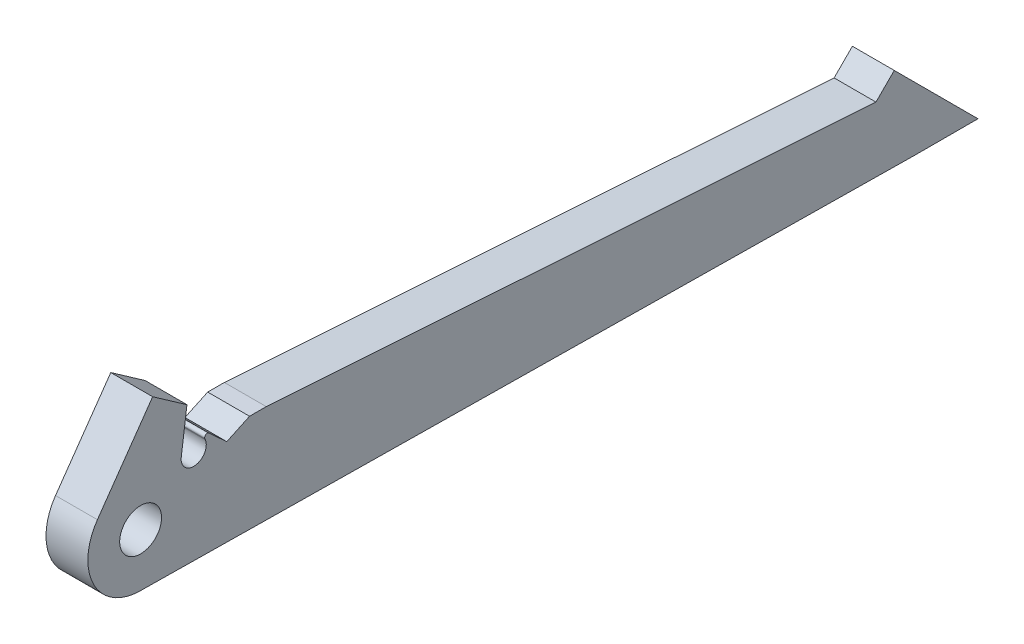
ISO-10303-21;
HEADER;
FILE_DESCRIPTION(('STEP AP214'),'2;1');
FILE_NAME('part.step','',(''),(''),'','','');
FILE_SCHEMA(('AUTOMOTIVE_DESIGN { 1 0 10303 214 1 1 1 1 }'));
ENDSEC;
DATA;
#1=APPLICATION_CONTEXT('core data for automotive mechanical design processes');
#2=APPLICATION_PROTOCOL_DEFINITION('international standard','automotive_design',2000,#1);
#3=PRODUCT_CONTEXT('',#1,'mechanical');
#4=PRODUCT('Part','Part','',(#3));
#5=PRODUCT_RELATED_PRODUCT_CATEGORY('part','',(#4));
#6=PRODUCT_DEFINITION_FORMATION('','',#4);
#7=PRODUCT_DEFINITION_CONTEXT('part definition',#1,'design');
#8=PRODUCT_DEFINITION('design','',#6,#7);
#9=PRODUCT_DEFINITION_SHAPE('','',#8);
#10=(LENGTH_UNIT() NAMED_UNIT(*) SI_UNIT(.MILLI.,.METRE.));
#11=(NAMED_UNIT(*) PLANE_ANGLE_UNIT() SI_UNIT($,.RADIAN.));
#12=(NAMED_UNIT(*) SI_UNIT($,.STERADIAN.) SOLID_ANGLE_UNIT());
#13=UNCERTAINTY_MEASURE_WITH_UNIT(LENGTH_MEASURE(1.E-05),#10,'distance_accuracy_value','');
#14=(GEOMETRIC_REPRESENTATION_CONTEXT(3) GLOBAL_UNCERTAINTY_ASSIGNED_CONTEXT((#13)) GLOBAL_UNIT_ASSIGNED_CONTEXT((#10,
#11,#12)) REPRESENTATION_CONTEXT('',''));
#15=CARTESIAN_POINT('',(0.,0.,0.));
#16=DIRECTION('',(0.,0.,1.));
#17=DIRECTION('',(1.,0.,0.));
#18=AXIS2_PLACEMENT_3D('',#15,#16,#17);
#19=CARTESIAN_POINT('',(6.35,9.525,-176.47164647412));
#20=DIRECTION('',(1.,0.,0.));
#21=DIRECTION('',(0.,0.,-1.));
#22=AXIS2_PLACEMENT_3D('',#19,#20,#21);
#23=PLANE('',#22);
#24=DIRECTION('',(0.,0.675997213115544,0.736904178207735));
#25=VECTOR('',#24,1.);
#26=CARTESIAN_POINT('',(6.35,14.554850228429,-189.540378321137));
#27=LINE('',#26,#25);
#28=CARTESIAN_POINT('',(6.35,14.554850228429,-189.540378321137));
#29=VERTEX_POINT('',#28);
#30=CARTESIAN_POINT('',(6.35,17.0473052344062,-186.823354534258));
#31=VERTEX_POINT('',#30);
#32=EDGE_CURVE('E245',#29,#31,#27,.T.);
#33=ORIENTED_EDGE('',*,*,#32,.T.);
#34=CARTESIAN_POINT('',(6.35,16.766544742509,-186.565799596061));
#35=DIRECTION('',(1.,0.,0.));
#36=DIRECTION('',(0.,0.,-1.));
#37=AXIS2_PLACEMENT_3D('',#34,#35,#36);
#38=CIRCLE('',#37,0.381);
#39=CARTESIAN_POINT('',(6.35,16.6212011416771,-186.213611808514));
#40=VERTEX_POINT('',#39);
#41=EDGE_CURVE('E51',#31,#40,#38,.T.);
#42=ORIENTED_EDGE('',*,*,#41,.T.);
#43=DIRECTION('',(0.,-0.924377395136311,-0.381479267275442));
#44=VECTOR('',#43,1.);
#45=CARTESIAN_POINT('',(6.35,18.2069999283971,-185.559172006775));
#46=LINE('',#45,#44);
#47=CARTESIAN_POINT('',(6.35,16.4460609906625,-186.285890010935));
#48=VERTEX_POINT('',#47);
#49=EDGE_CURVE('E247',#40,#48,#46,.T.);
#50=ORIENTED_EDGE('',*,*,#49,.T.);
#51=CARTESIAN_POINT('',(6.35,15.7193429865027,-184.524951073201));
#52=DIRECTION('',(-1.,0.,0.));
#53=DIRECTION('',(0.,0.,1.));
#54=AXIS2_PLACEMENT_3D('',#51,#52,#53);
#55=CIRCLE('',#54,1.90499999999998);
#56=CARTESIAN_POINT('',(6.35,15.9704562023801,-182.636574216529));
#57=VERTEX_POINT('',#56);
#58=EDGE_CURVE('E249',#48,#57,#55,.T.);
#59=ORIENTED_EDGE('',*,*,#58,.T.);
#60=DIRECTION('',(0.,0.991273940509858,-0.131817961090505));
#61=VECTOR('',#60,1.);
#62=CARTESIAN_POINT('',(6.35,15.9704562023801,-182.636574216529));
#63=LINE('',#62,#61);
#64=CARTESIAN_POINT('',(6.35,22.4356903032563,-183.496310301906));
#65=VERTEX_POINT('',#64);
#66=EDGE_CURVE('E251',#57,#65,#63,.T.);
#67=ORIENTED_EDGE('',*,*,#66,.T.);
#68=DIRECTION('',(0.,0.573576436351047,0.819152044288991));
#69=VECTOR('',#68,1.);
#70=CARTESIAN_POINT('',(6.35,26.0779006740854,-178.294694820671));
#71=LINE('',#70,#69);
#72=CARTESIAN_POINT('',(6.35,26.0779006740854,-178.294694820671));
#73=VERTEX_POINT('',#72);
#74=EDGE_CURVE('E253',#65,#73,#71,.T.);
#75=ORIENTED_EDGE('',*,*,#74,.T.);
#76=DIRECTION('',(0.,-0.819152044288991,0.573576436351048));
#77=VECTOR('',#76,1.);
#78=CARTESIAN_POINT('',(6.35,14.1141850672447,-169.917610967764));
#79=LINE('',#78,#77);
#80=CARTESIAN_POINT('',(6.35,14.1141850672447,-169.917610967764));
#81=VERTEX_POINT('',#80);
#82=EDGE_CURVE('E255',#73,#81,#79,.T.);
#83=ORIENTED_EDGE('',*,*,#82,.T.);
#84=CARTESIAN_POINT('',(6.35,9.525,-176.47164647412));
#85=DIRECTION('',(1.,0.,0.));
#86=DIRECTION('',(0.,0.,-1.));
#87=AXIS2_PLACEMENT_3D('',#84,#85,#86);
#88=CIRCLE('',#87,8.00100000000001);
#89=CARTESIAN_POINT('',(6.35,1.52470715135464,-176.365272906379));
#90=VERTEX_POINT('',#89);
#91=EDGE_CURVE('E236',#81,#90,#88,.T.);
#92=ORIENTED_EDGE('',*,*,#91,.T.);
#93=DIRECTION('',(0.,-0.0132950340883751,-0.999911617128528));
#94=VECTOR('',#93,1.);
#95=CARTESIAN_POINT('',(6.35,1.27000000001228,-195.521646474134));
#96=LINE('',#95,#94);
#97=CARTESIAN_POINT('',(6.35,1.27000000001228,-195.521646474134));
#98=VERTEX_POINT('',#97);
#99=EDGE_CURVE('E239',#90,#98,#96,.T.);
#100=ORIENTED_EDGE('',*,*,#99,.T.);
#101=DIRECTION('',(0.,-0.0129021517906544,-0.999916763775451));
#102=VECTOR('',#101,1.);
#103=CARTESIAN_POINT('',(6.35,1.27000000001228,-195.521646474134));
#104=LINE('',#103,#102);
#105=CARTESIAN_POINT('',(6.35,1.22755538373154E-11,-293.946646474108));
#106=VERTEX_POINT('',#105);
#107=EDGE_CURVE('E225',#98,#106,#104,.T.);
#108=ORIENTED_EDGE('',*,*,#107,.T.);
#109=DIRECTION('',(0.,0.,-1.));
#110=VECTOR('',#109,1.);
#111=CARTESIAN_POINT('',(6.35,1.22755538373154E-11,-293.946646474108));
#112=LINE('',#111,#110);
#113=CARTESIAN_POINT('',(6.35,1.22755538373154E-11,-303.471646474121));
#114=VERTEX_POINT('',#113);
#115=EDGE_CURVE('E166',#106,#114,#112,.T.);
#116=ORIENTED_EDGE('',*,*,#115,.T.);
#117=DIRECTION('',(0.,0.70710678118655,0.707106781186545));
#118=VECTOR('',#117,1.);
#119=CARTESIAN_POINT('',(6.35,9.52500000002455,-293.946646474108));
#120=LINE('',#119,#118);
#121=CARTESIAN_POINT('',(6.35,12.7000000000246,-290.771646474108));
#122=VERTEX_POINT('',#121);
#123=EDGE_CURVE('E158',#114,#122,#120,.T.);
#124=ORIENTED_EDGE('',*,*,#123,.T.);
#125=DIRECTION('',(0.,-0.707106781186553,0.707106781186541));
#126=VECTOR('',#125,1.);
#127=CARTESIAN_POINT('',(6.35,12.7000000000246,-290.771646474108));
#128=LINE('',#127,#126);
#129=CARTESIAN_POINT('',(6.35,9.92631493372846,-287.997961407812));
#130=VERTEX_POINT('',#129);
#131=EDGE_CURVE('E162',#122,#130,#128,.T.);
#132=ORIENTED_EDGE('',*,*,#131,.T.);
#133=DIRECTION('',(0.,0.0673097998383365,0.997732123791613));
#134=VECTOR('',#133,1.);
#135=CARTESIAN_POINT('',(6.35,16.1650258056597,-195.52164647412));
#136=LINE('',#135,#134);
#137=CARTESIAN_POINT('',(6.35,16.1650258056597,-195.52164647412));
#138=VERTEX_POINT('',#137);
#139=EDGE_CURVE('E169',#130,#138,#136,.T.);
#140=ORIENTED_EDGE('',*,*,#139,.T.);
#141=DIRECTION('',(0.,5.50284273886857E-13,1.));
#142=VECTOR('',#141,1.);
#143=CARTESIAN_POINT('',(6.35,16.1650258056611,-192.993410989747));
#144=LINE('',#143,#142);
#145=CARTESIAN_POINT('',(6.35,16.1650258056611,-192.993410989747));
#146=VERTEX_POINT('',#145);
#147=EDGE_CURVE('E241',#138,#146,#144,.T.);
#148=ORIENTED_EDGE('',*,*,#147,.T.);
#149=DIRECTION('',(0.,-0.422618261740698,0.90630778703665));
#150=VECTOR('',#149,1.);
#151=CARTESIAN_POINT('',(6.35,14.8232128246343,-190.115883765906));
#152=LINE('',#151,#150);
#153=EDGE_CURVE('E243',#146,#29,#152,.T.);
#154=ORIENTED_EDGE('',*,*,#153,.T.);
#155=EDGE_LOOP('',(#33,#42,#50,#59,#67,#75,#83,#92,#100,#108,#116,#124,#132,#140,#148,#154));
#156=FACE_BOUND('',#155,.T.);
#157=CARTESIAN_POINT('',(6.35,9.525,-176.47164647412));
#158=DIRECTION('',(1.,0.,0.));
#159=DIRECTION('',(0.,0.,-1.));
#160=AXIS2_PLACEMENT_3D('',#157,#158,#159);
#161=CIRCLE('',#160,3.17499999999995);
#162=CARTESIAN_POINT('',(6.35,9.525,-179.64664647412));
#163=VERTEX_POINT('',#162);
#164=EDGE_CURVE('E232',#163,#163,#161,.T.);
#165=ORIENTED_EDGE('',*,*,#164,.F.);
#166=EDGE_LOOP('',(#165));
#167=FACE_BOUND('',#166,.T.);
#168=ADVANCED_FACE('F43',(#156,#167),#23,.T.);
#169=CARTESIAN_POINT('',(6.35,9.525,-176.47164647412));
#170=DIRECTION('',(-1.,0.,0.));
#171=DIRECTION('',(0.,0.,1.));
#172=AXIS2_PLACEMENT_3D('',#169,#170,#171);
#173=CYLINDRICAL_SURFACE('',#172,8.00100000000001);
#174=DIRECTION('',(-1.,0.,0.));
#175=VECTOR('',#174,1.);
#176=CARTESIAN_POINT('',(6.35,14.1141850672447,-169.917610967764));
#177=LINE('',#176,#175);
#178=CARTESIAN_POINT('',(0.,14.1141850672447,-169.917610967764));
#179=VERTEX_POINT('',#178);
#180=EDGE_CURVE('E257',#81,#179,#177,.T.);
#181=ORIENTED_EDGE('',*,*,#180,.T.);
#182=CARTESIAN_POINT('',(0.,9.525,-176.47164647412));
#183=DIRECTION('',(1.,0.,0.));
#184=DIRECTION('',(0.,0.,-1.));
#185=AXIS2_PLACEMENT_3D('',#182,#183,#184);
#186=CIRCLE('',#185,8.00100000000001);
#187=CARTESIAN_POINT('',(0.,1.52470715135464,-176.365272906379));
#188=VERTEX_POINT('',#187);
#189=EDGE_CURVE('E197',#179,#188,#186,.T.);
#190=ORIENTED_EDGE('',*,*,#189,.T.);
#191=DIRECTION('',(-1.,0.,0.));
#192=VECTOR('',#191,1.);
#193=CARTESIAN_POINT('',(6.35,1.52470715135464,-176.365272906379));
#194=LINE('',#193,#192);
#195=EDGE_CURVE('E284',#90,#188,#194,.T.);
#196=ORIENTED_EDGE('',*,*,#195,.F.);
#197=ORIENTED_EDGE('',*,*,#91,.F.);
#198=EDGE_LOOP('',(#181,#190,#196,#197));
#199=FACE_BOUND('',#198,.T.);
#200=ADVANCED_FACE('F325',(#199),#173,.T.);
#201=CARTESIAN_POINT('',(6.35,1.27000000001228,-195.521646474134));
#202=DIRECTION('',(0.,0.999911617128528,-0.0132950340883751));
#203=DIRECTION('',(0.,0.0132950340883751,0.999911617128528));
#204=AXIS2_PLACEMENT_3D('',#201,#202,#203);
#205=PLANE('',#204);
#206=ORIENTED_EDGE('',*,*,#195,.T.);
#207=DIRECTION('',(0.,-0.0132950340883751,-0.999911617128528));
#208=VECTOR('',#207,1.);
#209=CARTESIAN_POINT('',(0.,1.27000000001228,-195.521646474134));
#210=LINE('',#209,#208);
#211=CARTESIAN_POINT('',(0.,1.27000000001228,-195.521646474134));
#212=VERTEX_POINT('',#211);
#213=EDGE_CURVE('E194',#188,#212,#210,.T.);
#214=ORIENTED_EDGE('',*,*,#213,.T.);
#215=DIRECTION('',(-1.,0.,0.));
#216=VECTOR('',#215,1.);
#217=CARTESIAN_POINT('',(6.35,1.27000000001228,-195.521646474134));
#218=LINE('',#217,#216);
#219=EDGE_CURVE('E281',#98,#212,#218,.T.);
#220=ORIENTED_EDGE('',*,*,#219,.F.);
#221=ORIENTED_EDGE('',*,*,#99,.F.);
#222=EDGE_LOOP('',(#206,#214,#220,#221));
#223=FACE_BOUND('',#222,.T.);
#224=ADVANCED_FACE('F321',(#223),#205,.F.);
#225=CARTESIAN_POINT('',(6.35,16.1650258056611,-192.993410989747));
#226=DIRECTION('',(0.,-1.,5.50284273886857E-13));
#227=DIRECTION('',(0.,-5.50284273886857E-13,-1.));
#228=AXIS2_PLACEMENT_3D('',#225,#226,#227);
#229=PLANE('',#228);
#230=DIRECTION('',(-1.,0.,0.));
#231=VECTOR('',#230,1.);
#232=CARTESIAN_POINT('',(6.35,16.1650258056597,-195.52164647412));
#233=LINE('',#232,#231);
#234=CARTESIAN_POINT('',(0.,16.1650258056597,-195.52164647412));
#235=VERTEX_POINT('',#234);
#236=EDGE_CURVE('E278',#138,#235,#233,.T.);
#237=ORIENTED_EDGE('',*,*,#236,.T.);
#238=DIRECTION('',(0.,5.50284273886857E-13,1.));
#239=VECTOR('',#238,1.);
#240=CARTESIAN_POINT('',(0.,16.1650258056611,-192.993410989747));
#241=LINE('',#240,#239);
#242=CARTESIAN_POINT('',(0.,16.1650258056611,-192.993410989747));
#243=VERTEX_POINT('',#242);
#244=EDGE_CURVE('E191',#235,#243,#241,.T.);
#245=ORIENTED_EDGE('',*,*,#244,.T.);
#246=DIRECTION('',(-1.,0.,0.));
#247=VECTOR('',#246,1.);
#248=CARTESIAN_POINT('',(6.35,16.1650258056611,-192.993410989747));
#249=LINE('',#248,#247);
#250=EDGE_CURVE('E275',#146,#243,#249,.T.);
#251=ORIENTED_EDGE('',*,*,#250,.F.);
#252=ORIENTED_EDGE('',*,*,#147,.F.);
#253=EDGE_LOOP('',(#237,#245,#251,#252));
#254=FACE_BOUND('',#253,.T.);
#255=ADVANCED_FACE('F308',(#254),#229,.F.);
#256=CARTESIAN_POINT('',(6.35,14.554850228429,-189.540378321137));
#257=DIRECTION('',(0.,-0.906307787036655,-0.422618261740688));
#258=DIRECTION('',(0.,0.422618261740688,-0.906307787036655));
#259=AXIS2_PLACEMENT_3D('',#256,#257,#258);
#260=PLANE('',#259);
#261=ORIENTED_EDGE('',*,*,#250,.T.);
#262=DIRECTION('',(0.,-0.422618261740688,0.906307787036655));
#263=VECTOR('',#262,1.);
#264=CARTESIAN_POINT('',(0.,14.554850228429,-189.540378321137));
#265=LINE('',#264,#263);
#266=CARTESIAN_POINT('',(0.,14.554850228429,-189.540378321137));
#267=VERTEX_POINT('',#266);
#268=EDGE_CURVE('E215',#243,#267,#265,.T.);
#269=ORIENTED_EDGE('',*,*,#268,.T.);
#270=DIRECTION('',(-1.,0.,0.));
#271=VECTOR('',#270,1.);
#272=CARTESIAN_POINT('',(6.35,14.554850228429,-189.540378321137));
#273=LINE('',#272,#271);
#274=EDGE_CURVE('E272',#29,#267,#273,.T.);
#275=ORIENTED_EDGE('',*,*,#274,.F.);
#276=ORIENTED_EDGE('',*,*,#153,.F.);
#277=EDGE_LOOP('',(#261,#269,#275,#276));
#278=FACE_BOUND('',#277,.T.);
#279=ADVANCED_FACE('F304',(#278),#260,.F.);
#280=CARTESIAN_POINT('',(6.35,14.554850228429,-189.540378321137));
#281=DIRECTION('',(0.,-0.736904178207735,0.675997213115544));
#282=DIRECTION('',(0.,-0.675997213115544,-0.736904178207735));
#283=AXIS2_PLACEMENT_3D('',#280,#281,#282);
#284=PLANE('',#283);
#285=ORIENTED_EDGE('',*,*,#274,.T.);
#286=DIRECTION('',(0.,0.675997213115544,0.736904178207735));
#287=VECTOR('',#286,1.);
#288=CARTESIAN_POINT('',(0.,14.554850228429,-189.540378321137));
#289=LINE('',#288,#287);
#290=CARTESIAN_POINT('',(0.,17.0473052344062,-186.823354534258));
#291=VERTEX_POINT('',#290);
#292=EDGE_CURVE('E220',#267,#291,#289,.T.);
#293=ORIENTED_EDGE('',*,*,#292,.T.);
#294=DIRECTION('',(-1.,0.,0.));
#295=VECTOR('',#294,1.);
#296=CARTESIAN_POINT('',(6.35,17.0473052344062,-186.823354534258));
#297=LINE('',#296,#295);
#298=EDGE_CURVE('E65',#291,#31,#297,.F.);
#299=ORIENTED_EDGE('',*,*,#298,.T.);
#300=ORIENTED_EDGE('',*,*,#32,.F.);
#301=EDGE_LOOP('',(#285,#293,#299,#300));
#302=FACE_BOUND('',#301,.T.);
#303=ADVANCED_FACE('F300',(#302),#284,.F.);
#304=CARTESIAN_POINT('',(6.35,18.2069999283971,-185.559172006775));
#305=DIRECTION('',(0.,0.381479267275442,-0.924377395136311));
#306=DIRECTION('',(0.,0.924377395136311,0.381479267275442));
#307=AXIS2_PLACEMENT_3D('',#304,#305,#306);
#308=PLANE('',#307);
#309=DIRECTION('',(-1.,0.,0.));
#310=VECTOR('',#309,1.);
#311=CARTESIAN_POINT('',(6.35,16.6212011416771,-186.213611808514));
#312=LINE('',#311,#310);
#313=CARTESIAN_POINT('',(0.,16.6212011416771,-186.213611808514));
#314=VERTEX_POINT('',#313);
#315=EDGE_CURVE('E287',#40,#314,#312,.T.);
#316=ORIENTED_EDGE('',*,*,#315,.T.);
#317=DIRECTION('',(0.,-0.924377395136311,-0.381479267275442));
#318=VECTOR('',#317,1.);
#319=CARTESIAN_POINT('',(0.,18.2069999283971,-185.559172006775));
#320=LINE('',#319,#318);
#321=CARTESIAN_POINT('',(0.,16.4460609906625,-186.285890010935));
#322=VERTEX_POINT('',#321);
#323=EDGE_CURVE('E212',#314,#322,#320,.T.);
#324=ORIENTED_EDGE('',*,*,#323,.T.);
#325=DIRECTION('',(-1.,0.,0.));
#326=VECTOR('',#325,1.);
#327=CARTESIAN_POINT('',(6.35,16.4460609906625,-186.285890010935));
#328=LINE('',#327,#326);
#329=EDGE_CURVE('E269',#48,#322,#328,.T.);
#330=ORIENTED_EDGE('',*,*,#329,.F.);
#331=ORIENTED_EDGE('',*,*,#49,.F.);
#332=EDGE_LOOP('',(#316,#324,#330,#331));
#333=FACE_BOUND('',#332,.T.);
#334=ADVANCED_FACE('F296',(#333),#308,.F.);
#335=CARTESIAN_POINT('',(6.35,15.7193429865027,-184.524951073201));
#336=DIRECTION('',(-1.,0.,0.));
#337=DIRECTION('',(0.,0.,1.));
#338=AXIS2_PLACEMENT_3D('',#335,#336,#337);
#339=CYLINDRICAL_SURFACE('',#338,1.90499999999998);
#340=ORIENTED_EDGE('',*,*,#329,.T.);
#341=CARTESIAN_POINT('',(0.,15.7193429865027,-184.524951073201));
#342=DIRECTION('',(1.,0.,0.));
#343=DIRECTION('',(0.,0.,-1.));
#344=AXIS2_PLACEMENT_3D('',#341,#342,#343);
#345=CIRCLE('',#344,1.90499999999998);
#346=CARTESIAN_POINT('',(0.,15.9704562023801,-182.636574216529));
#347=VERTEX_POINT('',#346);
#348=EDGE_CURVE('E209',#322,#347,#345,.F.);
#349=ORIENTED_EDGE('',*,*,#348,.T.);
#350=DIRECTION('',(-1.,0.,0.));
#351=VECTOR('',#350,1.);
#352=CARTESIAN_POINT('',(6.35,15.9704562023801,-182.636574216529));
#353=LINE('',#352,#351);
#354=EDGE_CURVE('E266',#57,#347,#353,.T.);
#355=ORIENTED_EDGE('',*,*,#354,.F.);
#356=ORIENTED_EDGE('',*,*,#58,.F.);
#357=EDGE_LOOP('',(#340,#349,#355,#356));
#358=FACE_BOUND('',#357,.T.);
#359=ADVANCED_FACE('F340',(#358),#339,.F.);
#360=CARTESIAN_POINT('',(6.35,15.9704562023801,-182.636574216529));
#361=DIRECTION('',(0.,0.131817961090505,0.991273940509858));
#362=DIRECTION('',(0.,-0.991273940509858,0.131817961090505));
#363=AXIS2_PLACEMENT_3D('',#360,#361,#362);
#364=PLANE('',#363);
#365=ORIENTED_EDGE('',*,*,#354,.T.);
#366=DIRECTION('',(0.,0.991273940509858,-0.131817961090505));
#367=VECTOR('',#366,1.);
#368=CARTESIAN_POINT('',(0.,15.9704562023801,-182.636574216529));
#369=LINE('',#368,#367);
#370=CARTESIAN_POINT('',(0.,22.4356903032563,-183.496310301906));
#371=VERTEX_POINT('',#370);
#372=EDGE_CURVE('E206',#347,#371,#369,.T.);
#373=ORIENTED_EDGE('',*,*,#372,.T.);
#374=DIRECTION('',(-1.,0.,0.));
#375=VECTOR('',#374,1.);
#376=CARTESIAN_POINT('',(6.35,22.4356903032563,-183.496310301906));
#377=LINE('',#376,#375);
#378=EDGE_CURVE('E263',#65,#371,#377,.T.);
#379=ORIENTED_EDGE('',*,*,#378,.F.);
#380=ORIENTED_EDGE('',*,*,#66,.F.);
#381=EDGE_LOOP('',(#365,#373,#379,#380));
#382=FACE_BOUND('',#381,.T.);
#383=ADVANCED_FACE('F336',(#382),#364,.F.);
#384=CARTESIAN_POINT('',(6.35,26.0779006740854,-178.294694820671));
#385=DIRECTION('',(0.,-0.819152044288991,0.573576436351047));
#386=DIRECTION('',(0.,-0.573576436351047,-0.819152044288991));
#387=AXIS2_PLACEMENT_3D('',#384,#385,#386);
#388=PLANE('',#387);
#389=ORIENTED_EDGE('',*,*,#378,.T.);
#390=DIRECTION('',(0.,0.573576436351047,0.819152044288991));
#391=VECTOR('',#390,1.);
#392=CARTESIAN_POINT('',(0.,26.0779006740854,-178.294694820671));
#393=LINE('',#392,#391);
#394=CARTESIAN_POINT('',(0.,26.0779006740854,-178.294694820671));
#395=VERTEX_POINT('',#394);
#396=EDGE_CURVE('E203',#371,#395,#393,.T.);
#397=ORIENTED_EDGE('',*,*,#396,.T.);
#398=DIRECTION('',(-1.,0.,0.));
#399=VECTOR('',#398,1.);
#400=CARTESIAN_POINT('',(6.35,26.0779006740854,-178.294694820671));
#401=LINE('',#400,#399);
#402=EDGE_CURVE('E260',#73,#395,#401,.T.);
#403=ORIENTED_EDGE('',*,*,#402,.F.);
#404=ORIENTED_EDGE('',*,*,#74,.F.);
#405=EDGE_LOOP('',(#389,#397,#403,#404));
#406=FACE_BOUND('',#405,.T.);
#407=ADVANCED_FACE('F333',(#406),#388,.F.);
#408=CARTESIAN_POINT('',(6.35,14.1141850672447,-169.917610967764));
#409=DIRECTION('',(0.,-0.573576436351048,-0.819152044288991));
#410=DIRECTION('',(0.,0.819152044288991,-0.573576436351048));
#411=AXIS2_PLACEMENT_3D('',#408,#409,#410);
#412=PLANE('',#411);
#413=ORIENTED_EDGE('',*,*,#402,.T.);
#414=DIRECTION('',(0.,-0.819152044288991,0.573576436351048));
#415=VECTOR('',#414,1.);
#416=CARTESIAN_POINT('',(0.,14.1141850672447,-169.917610967764));
#417=LINE('',#416,#415);
#418=EDGE_CURVE('E200',#395,#179,#417,.T.);
#419=ORIENTED_EDGE('',*,*,#418,.T.);
#420=ORIENTED_EDGE('',*,*,#180,.F.);
#421=ORIENTED_EDGE('',*,*,#82,.F.);
#422=EDGE_LOOP('',(#413,#419,#420,#421));
#423=FACE_BOUND('',#422,.T.);
#424=ADVANCED_FACE('F328',(#423),#412,.F.);
#425=CARTESIAN_POINT('',(6.35,9.525,-176.47164647412));
#426=DIRECTION('',(-1.,0.,0.));
#427=DIRECTION('',(0.,0.,1.));
#428=AXIS2_PLACEMENT_3D('',#425,#426,#427);
#429=CYLINDRICAL_SURFACE('',#428,3.17499999999995);
#430=CARTESIAN_POINT('',(0.,9.525,-176.47164647412));
#431=DIRECTION('',(1.,0.,0.));
#432=DIRECTION('',(0.,0.,-1.));
#433=AXIS2_PLACEMENT_3D('',#430,#431,#432);
#434=CIRCLE('',#433,3.17499999999995);
#435=CARTESIAN_POINT('',(0.,9.525,-179.64664647412));
#436=VERTEX_POINT('',#435);
#437=EDGE_CURVE('E222',#436,#436,#434,.T.);
#438=ORIENTED_EDGE('',*,*,#437,.F.);
#439=EDGE_LOOP('',(#438));
#440=FACE_BOUND('',#439,.T.);
#441=ORIENTED_EDGE('',*,*,#164,.T.);
#442=EDGE_LOOP('',(#441));
#443=FACE_BOUND('',#442,.T.);
#444=ADVANCED_FACE('F356',(#440,#443),#429,.F.);
#445=CARTESIAN_POINT('',(6.35,16.766544742509,-186.565799596061));
#446=DIRECTION('',(-1.,0.,0.));
#447=DIRECTION('',(0.,0.,1.));
#448=AXIS2_PLACEMENT_3D('',#445,#446,#447);
#449=CYLINDRICAL_SURFACE('',#448,0.381);
#450=CARTESIAN_POINT('',(0.,16.766544742509,-186.565799596061));
#451=DIRECTION('',(1.,0.,0.));
#452=DIRECTION('',(0.,0.,-1.));
#453=AXIS2_PLACEMENT_3D('',#450,#451,#452);
#454=CIRCLE('',#453,0.381);
#455=EDGE_CURVE('E218',#314,#291,#454,.F.);
#456=ORIENTED_EDGE('',*,*,#455,.F.);
#457=ORIENTED_EDGE('',*,*,#315,.F.);
#458=ORIENTED_EDGE('',*,*,#41,.F.);
#459=ORIENTED_EDGE('',*,*,#298,.F.);
#460=EDGE_LOOP('',(#456,#457,#458,#459));
#461=FACE_BOUND('',#460,.T.);
#462=ADVANCED_FACE('F45',(#461),#449,.T.);
#463=CARTESIAN_POINT('',(-115.503609923343,16.1650258056597,-195.52164647412));
#464=DIRECTION('',(0.,0.997732123791613,-0.0673097998383365));
#465=DIRECTION('',(0.,0.0673097998383365,0.997732123791613));
#466=AXIS2_PLACEMENT_3D('',#463,#464,#465);
#467=PLANE('',#466);
#468=DIRECTION('',(1.,0.,0.));
#469=VECTOR('',#468,1.);
#470=CARTESIAN_POINT('',(-6.74295773514666,9.92631493372846,-287.997961407812));
#471=LINE('',#470,#469);
#472=CARTESIAN_POINT('',(0.,9.92631493372848,-287.997961407812));
#473=VERTEX_POINT('',#472);
#474=EDGE_CURVE('E177',#473,#130,#471,.T.);
#475=ORIENTED_EDGE('',*,*,#474,.F.);
#476=DIRECTION('',(0.,-0.0673097998383365,-0.997732123791613));
#477=VECTOR('',#476,1.);
#478=CARTESIAN_POINT('',(0.,16.1650258056597,-195.52164647412));
#479=LINE('',#478,#477);
#480=EDGE_CURVE('E188',#235,#473,#479,.T.);
#481=ORIENTED_EDGE('',*,*,#480,.F.);
#482=ORIENTED_EDGE('',*,*,#236,.F.);
#483=ORIENTED_EDGE('',*,*,#139,.F.);
#484=EDGE_LOOP('',(#475,#481,#482,#483));
#485=FACE_BOUND('',#484,.T.);
#486=ADVANCED_FACE('F312',(#485),#467,.T.);
#487=CARTESIAN_POINT('',(-115.503609923343,9.52500000002455,-293.946646474108));
#488=DIRECTION('',(0.,0.707106781186545,-0.70710678118655));
#489=DIRECTION('',(0.,0.70710678118655,0.707106781186545));
#490=AXIS2_PLACEMENT_3D('',#487,#488,#489);
#491=PLANE('',#490);
#492=DIRECTION('',(0.,-0.70710678118655,-0.707106781186545));
#493=VECTOR('',#492,1.);
#494=CARTESIAN_POINT('',(0.,9.52500000002455,-293.946646474108));
#495=LINE('',#494,#493);
#496=CARTESIAN_POINT('',(0.,12.7000000000246,-290.771646474108));
#497=VERTEX_POINT('',#496);
#498=CARTESIAN_POINT('',(0.,1.22749033160119E-11,-303.471646474121));
#499=VERTEX_POINT('',#498);
#500=EDGE_CURVE('E174',#497,#499,#495,.T.);
#501=ORIENTED_EDGE('',*,*,#500,.F.);
#502=DIRECTION('',(1.,0.,0.));
#503=VECTOR('',#502,1.);
#504=CARTESIAN_POINT('',(-6.74295773514666,12.7000000000246,-290.771646474108));
#505=LINE('',#504,#503);
#506=EDGE_CURVE('E172',#497,#122,#505,.T.);
#507=ORIENTED_EDGE('',*,*,#506,.T.);
#508=ORIENTED_EDGE('',*,*,#123,.F.);
#509=DIRECTION('',(1.,0.,0.));
#510=VECTOR('',#509,1.);
#511=CARTESIAN_POINT('',(-115.503609923343,1.22755538373154E-11,-303.471646474121));
#512=LINE('',#511,#510);
#513=EDGE_CURVE('E230',#499,#114,#512,.T.);
#514=ORIENTED_EDGE('',*,*,#513,.F.);
#515=EDGE_LOOP('',(#501,#507,#508,#514));
#516=FACE_BOUND('',#515,.T.);
#517=ADVANCED_FACE('F173',(#516),#491,.T.);
#518=CARTESIAN_POINT('',(-115.503609923343,1.22755538373154E-11,-293.946646474108));
#519=DIRECTION('',(0.,-1.,0.));
#520=DIRECTION('',(0.,0.,-1.));
#521=AXIS2_PLACEMENT_3D('',#518,#519,#520);
#522=PLANE('',#521);
#523=DIRECTION('',(0.,0.,1.));
#524=VECTOR('',#523,1.);
#525=CARTESIAN_POINT('',(0.,1.22755538373154E-11,-293.946646474108));
#526=LINE('',#525,#524);
#527=CARTESIAN_POINT('',(0.,1.22755538373154E-11,-293.946646474108));
#528=VERTEX_POINT('',#527);
#529=EDGE_CURVE('E57',#499,#528,#526,.T.);
#530=ORIENTED_EDGE('',*,*,#529,.F.);
#531=ORIENTED_EDGE('',*,*,#513,.T.);
#532=ORIENTED_EDGE('',*,*,#115,.F.);
#533=DIRECTION('',(1.,0.,0.));
#534=VECTOR('',#533,1.);
#535=CARTESIAN_POINT('',(-115.503609923343,1.22755538373154E-11,-293.946646474108));
#536=LINE('',#535,#534);
#537=EDGE_CURVE('E229',#528,#106,#536,.T.);
#538=ORIENTED_EDGE('',*,*,#537,.F.);
#539=EDGE_LOOP('',(#530,#531,#532,#538));
#540=FACE_BOUND('',#539,.T.);
#541=ADVANCED_FACE('F315',(#540),#522,.T.);
#542=CARTESIAN_POINT('',(-115.503609923343,1.27000000001228,-195.521646474134));
#543=DIRECTION('',(0.,-0.999916763775451,0.0129021517906544));
#544=DIRECTION('',(0.,-0.0129021517906544,-0.999916763775451));
#545=AXIS2_PLACEMENT_3D('',#542,#543,#544);
#546=PLANE('',#545);
#547=DIRECTION('',(0.,0.0129021517906544,0.999916763775451));
#548=VECTOR('',#547,1.);
#549=CARTESIAN_POINT('',(0.,1.27000000001228,-195.521646474134));
#550=LINE('',#549,#548);
#551=EDGE_CURVE('E12',#528,#212,#550,.T.);
#552=ORIENTED_EDGE('',*,*,#551,.F.);
#553=ORIENTED_EDGE('',*,*,#537,.T.);
#554=ORIENTED_EDGE('',*,*,#107,.F.);
#555=ORIENTED_EDGE('',*,*,#219,.T.);
#556=EDGE_LOOP('',(#552,#553,#554,#555));
#557=FACE_BOUND('',#556,.T.);
#558=ADVANCED_FACE('F318',(#557),#546,.T.);
#559=CARTESIAN_POINT('',(0.,9.525,-176.47164647412));
#560=DIRECTION('',(1.,0.,0.));
#561=DIRECTION('',(0.,0.,-1.));
#562=AXIS2_PLACEMENT_3D('',#559,#560,#561);
#563=PLANE('',#562);
#564=ORIENTED_EDGE('',*,*,#437,.T.);
#565=EDGE_LOOP('',(#564));
#566=FACE_BOUND('',#565,.T.);
#567=ORIENTED_EDGE('',*,*,#268,.F.);
#568=ORIENTED_EDGE('',*,*,#244,.F.);
#569=ORIENTED_EDGE('',*,*,#480,.T.);
#570=DIRECTION('',(0.,0.707106781186554,-0.707106781186542));
#571=VECTOR('',#570,1.);
#572=CARTESIAN_POINT('',(0.,12.7000000000246,-290.771646474108));
#573=LINE('',#572,#571);
#574=EDGE_CURVE('E184',#473,#497,#573,.T.);
#575=ORIENTED_EDGE('',*,*,#574,.T.);
#576=ORIENTED_EDGE('',*,*,#500,.T.);
#577=ORIENTED_EDGE('',*,*,#529,.T.);
#578=ORIENTED_EDGE('',*,*,#551,.T.);
#579=ORIENTED_EDGE('',*,*,#213,.F.);
#580=ORIENTED_EDGE('',*,*,#189,.F.);
#581=ORIENTED_EDGE('',*,*,#418,.F.);
#582=ORIENTED_EDGE('',*,*,#396,.F.);
#583=ORIENTED_EDGE('',*,*,#372,.F.);
#584=ORIENTED_EDGE('',*,*,#348,.F.);
#585=ORIENTED_EDGE('',*,*,#323,.F.);
#586=ORIENTED_EDGE('',*,*,#455,.T.);
#587=ORIENTED_EDGE('',*,*,#292,.F.);
#588=EDGE_LOOP('',(#567,#568,#569,#575,#576,#577,#578,#579,#580,#581,#582,#583,#584,#585,#586,#587));
#589=FACE_BOUND('',#588,.T.);
#590=ADVANCED_FACE('F299',(#566,#589),#563,.F.);
#591=CARTESIAN_POINT('',(-6.74295773514666,12.7000000000246,-290.771646474108));
#592=DIRECTION('',(0.,0.707106781186541,0.707106781186553));
#593=DIRECTION('',(0.,-0.707106781186554,0.707106781186542));
#594=AXIS2_PLACEMENT_3D('',#591,#592,#593);
#595=PLANE('',#594);
#596=ORIENTED_EDGE('',*,*,#574,.F.);
#597=ORIENTED_EDGE('',*,*,#474,.T.);
#598=ORIENTED_EDGE('',*,*,#131,.F.);
#599=ORIENTED_EDGE('',*,*,#506,.F.);
#600=EDGE_LOOP('',(#596,#597,#598,#599));
#601=FACE_BOUND('',#600,.T.);
#602=ADVANCED_FACE('F179',(#601),#595,.T.);
#603=CLOSED_SHELL('',(#168,#200,#224,#255,#279,#303,#334,#359,#383,#407,#424,#444,#462,#486,
#517,#541,#558,#590,#602));
#604=MANIFOLD_SOLID_BREP('B2',#603);
#605=ADVANCED_BREP_SHAPE_REPRESENTATION('',(#18,#604),#14);
#606=SHAPE_DEFINITION_REPRESENTATION(#9,#605);
ENDSEC;
END-ISO-10303-21;
